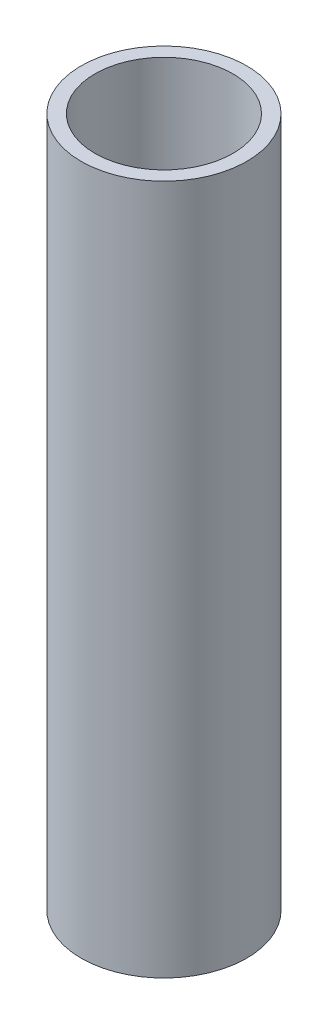
ISO-10303-21;
HEADER;
FILE_DESCRIPTION(('STEP AP214'),'2;1');
FILE_NAME('part.step','',(''),(''),'','','');
FILE_SCHEMA(('AUTOMOTIVE_DESIGN { 1 0 10303 214 1 1 1 1 }'));
ENDSEC;
DATA;
#1=APPLICATION_CONTEXT('core data for automotive mechanical design processes');
#2=APPLICATION_PROTOCOL_DEFINITION('international standard','automotive_design',2000,#1);
#3=PRODUCT_CONTEXT('',#1,'mechanical');
#4=PRODUCT('Part','Part','',(#3));
#5=PRODUCT_RELATED_PRODUCT_CATEGORY('part','',(#4));
#6=PRODUCT_DEFINITION_FORMATION('','',#4);
#7=PRODUCT_DEFINITION_CONTEXT('part definition',#1,'design');
#8=PRODUCT_DEFINITION('design','',#6,#7);
#9=PRODUCT_DEFINITION_SHAPE('','',#8);
#10=(LENGTH_UNIT() NAMED_UNIT(*) SI_UNIT(.MILLI.,.METRE.));
#11=(NAMED_UNIT(*) PLANE_ANGLE_UNIT() SI_UNIT($,.RADIAN.));
#12=(NAMED_UNIT(*) SI_UNIT($,.STERADIAN.) SOLID_ANGLE_UNIT());
#13=UNCERTAINTY_MEASURE_WITH_UNIT(LENGTH_MEASURE(1.E-05),#10,'distance_accuracy_value','');
#14=(GEOMETRIC_REPRESENTATION_CONTEXT(3) GLOBAL_UNCERTAINTY_ASSIGNED_CONTEXT((#13)) GLOBAL_UNIT_ASSIGNED_CONTEXT((#10,
#11,#12)) REPRESENTATION_CONTEXT('',''));
#15=CARTESIAN_POINT('',(0.,0.,0.));
#16=DIRECTION('',(0.,0.,1.));
#17=DIRECTION('',(1.,0.,0.));
#18=AXIS2_PLACEMENT_3D('',#15,#16,#17);
#19=CARTESIAN_POINT('',(0.,26.1689859870494,0.));
#20=DIRECTION('',(0.,1.,0.));
#21=DIRECTION('',(0.,0.,1.));
#22=AXIS2_PLACEMENT_3D('',#19,#20,#21);
#23=CYLINDRICAL_SURFACE('',#22,24.);
#24=CARTESIAN_POINT('',(0.,0.,0.));
#25=DIRECTION('',(0.,1.,0.));
#26=DIRECTION('',(0.,0.,1.));
#27=AXIS2_PLACEMENT_3D('',#24,#25,#26);
#28=CIRCLE('',#27,24.);
#29=CARTESIAN_POINT('',(0.,0.,24.));
#30=VERTEX_POINT('',#29);
#31=EDGE_CURVE('E47',#30,#30,#28,.T.);
#32=ORIENTED_EDGE('',*,*,#31,.T.);
#33=EDGE_LOOP('',(#32));
#34=FACE_BOUND('',#33,.T.);
#35=CARTESIAN_POINT('',(0.,200.,0.));
#36=DIRECTION('',(0.,1.,0.));
#37=DIRECTION('',(0.,0.,1.));
#38=AXIS2_PLACEMENT_3D('',#35,#36,#37);
#39=CIRCLE('',#38,24.);
#40=CARTESIAN_POINT('',(0.,200.,24.));
#41=VERTEX_POINT('',#40);
#42=EDGE_CURVE('E10',#41,#41,#39,.T.);
#43=ORIENTED_EDGE('',*,*,#42,.F.);
#44=EDGE_LOOP('',(#43));
#45=FACE_BOUND('',#44,.T.);
#46=ADVANCED_FACE('F33',(#34,#45),#23,.T.);
#47=CARTESIAN_POINT('',(-24.,200.,0.));
#48=DIRECTION('',(0.,-1.,0.));
#49=DIRECTION('',(0.,0.,-1.));
#50=AXIS2_PLACEMENT_3D('',#47,#48,#49);
#51=PLANE('',#50);
#52=CARTESIAN_POINT('',(0.,200.,0.));
#53=DIRECTION('',(0.,1.,0.));
#54=DIRECTION('',(0.,0.,1.));
#55=AXIS2_PLACEMENT_3D('',#52,#53,#54);
#56=CIRCLE('',#55,20.);
#57=CARTESIAN_POINT('',(0.,200.,20.));
#58=VERTEX_POINT('',#57);
#59=EDGE_CURVE('E39',#58,#58,#56,.T.);
#60=ORIENTED_EDGE('',*,*,#59,.F.);
#61=EDGE_LOOP('',(#60));
#62=FACE_BOUND('',#61,.T.);
#63=ORIENTED_EDGE('',*,*,#42,.T.);
#64=EDGE_LOOP('',(#63));
#65=FACE_BOUND('',#64,.T.);
#66=ADVANCED_FACE('F63',(#62,#65),#51,.F.);
#67=CARTESIAN_POINT('',(0.,26.1689859870494,0.));
#68=DIRECTION('',(0.,1.,0.));
#69=DIRECTION('',(0.,0.,1.));
#70=AXIS2_PLACEMENT_3D('',#67,#68,#69);
#71=CYLINDRICAL_SURFACE('',#70,20.);
#72=CARTESIAN_POINT('',(0.,0.,0.));
#73=DIRECTION('',(0.,1.,0.));
#74=DIRECTION('',(0.,0.,1.));
#75=AXIS2_PLACEMENT_3D('',#72,#73,#74);
#76=CIRCLE('',#75,20.);
#77=CARTESIAN_POINT('',(0.,0.,20.));
#78=VERTEX_POINT('',#77);
#79=EDGE_CURVE('E43',#78,#78,#76,.T.);
#80=ORIENTED_EDGE('',*,*,#79,.F.);
#81=EDGE_LOOP('',(#80));
#82=FACE_BOUND('',#81,.T.);
#83=ORIENTED_EDGE('',*,*,#59,.T.);
#84=EDGE_LOOP('',(#83));
#85=FACE_BOUND('',#84,.T.);
#86=ADVANCED_FACE('F58',(#82,#85),#71,.F.);
#87=CARTESIAN_POINT('',(-20.,0.,0.));
#88=DIRECTION('',(0.,1.,0.));
#89=DIRECTION('',(0.,0.,1.));
#90=AXIS2_PLACEMENT_3D('',#87,#88,#89);
#91=PLANE('',#90);
#92=ORIENTED_EDGE('',*,*,#31,.F.);
#93=EDGE_LOOP('',(#92));
#94=FACE_BOUND('',#93,.T.);
#95=ORIENTED_EDGE('',*,*,#79,.T.);
#96=EDGE_LOOP('',(#95));
#97=FACE_BOUND('',#96,.T.);
#98=ADVANCED_FACE('F55',(#94,#97),#91,.F.);
#99=CLOSED_SHELL('',(#46,#66,#86,#98));
#100=MANIFOLD_SOLID_BREP('B2',#99);
#101=ADVANCED_BREP_SHAPE_REPRESENTATION('',(#18,#100),#14);
#102=SHAPE_DEFINITION_REPRESENTATION(#9,#101);
ENDSEC;
END-ISO-10303-21;
